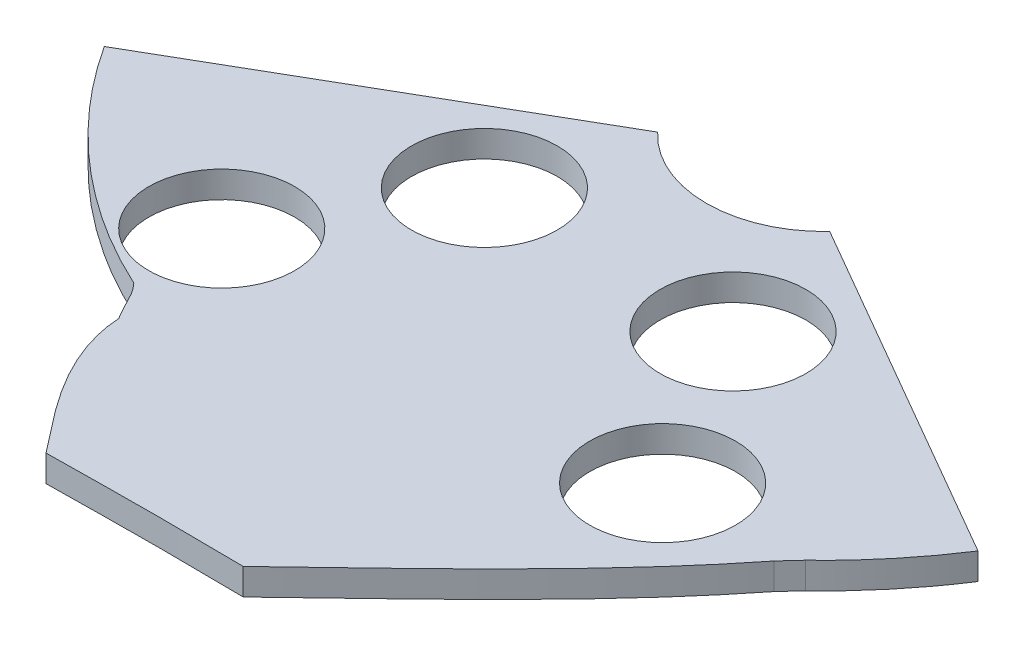
ISO-10303-21;
HEADER;
FILE_DESCRIPTION(('STEP AP214'),'2;1');
FILE_NAME('part.step','',(''),(''),'','','');
FILE_SCHEMA(('AUTOMOTIVE_DESIGN { 1 0 10303 214 1 1 1 1 }'));
ENDSEC;
DATA;
#1=APPLICATION_CONTEXT('core data for automotive mechanical design processes');
#2=APPLICATION_PROTOCOL_DEFINITION('international standard','automotive_design',2000,#1);
#3=PRODUCT_CONTEXT('',#1,'mechanical');
#4=PRODUCT('Part','Part','',(#3));
#5=PRODUCT_RELATED_PRODUCT_CATEGORY('part','',(#4));
#6=PRODUCT_DEFINITION_FORMATION('','',#4);
#7=PRODUCT_DEFINITION_CONTEXT('part definition',#1,'design');
#8=PRODUCT_DEFINITION('design','',#6,#7);
#9=PRODUCT_DEFINITION_SHAPE('','',#8);
#10=(LENGTH_UNIT() NAMED_UNIT(*) SI_UNIT(.MILLI.,.METRE.));
#11=(NAMED_UNIT(*) PLANE_ANGLE_UNIT() SI_UNIT($,.RADIAN.));
#12=(NAMED_UNIT(*) SI_UNIT($,.STERADIAN.) SOLID_ANGLE_UNIT());
#13=UNCERTAINTY_MEASURE_WITH_UNIT(LENGTH_MEASURE(1.E-05),#10,'distance_accuracy_value','');
#14=(GEOMETRIC_REPRESENTATION_CONTEXT(3) GLOBAL_UNCERTAINTY_ASSIGNED_CONTEXT((#13)) GLOBAL_UNIT_ASSIGNED_CONTEXT((#10,
#11,#12)) REPRESENTATION_CONTEXT('',''));
#15=CARTESIAN_POINT('',(0.,0.,0.));
#16=DIRECTION('',(0.,0.,1.));
#17=DIRECTION('',(1.,0.,0.));
#18=AXIS2_PLACEMENT_3D('',#15,#16,#17);
#19=CARTESIAN_POINT('',(-51.3744656245149,-79.736,59.3542968088145));
#20=DIRECTION('',(0.,-1.,0.));
#21=DIRECTION('',(0.,0.,-1.));
#22=AXIS2_PLACEMENT_3D('',#19,#20,#21);
#23=PLANE('',#22);
#24=CARTESIAN_POINT('',(18.75,-79.736,32.476));
#25=DIRECTION('',(0.,-1.,0.));
#26=DIRECTION('',(0.,0.,-1.));
#27=AXIS2_PLACEMENT_3D('',#24,#25,#26);
#28=CIRCLE('',#27,10.999845998306);
#29=CARTESIAN_POINT('',(18.75,-79.736,21.476154001694));
#30=VERTEX_POINT('',#29);
#31=EDGE_CURVE('E441',#30,#30,#28,.T.);
#32=ORIENTED_EDGE('',*,*,#31,.F.);
#33=EDGE_LOOP('',(#32));
#34=FACE_BOUND('',#33,.T.);
#35=CARTESIAN_POINT('',(-33.25,-79.736,57.591));
#36=DIRECTION('',(0.,-1.,0.));
#37=DIRECTION('',(0.,0.,-1.));
#38=AXIS2_PLACEMENT_3D('',#35,#36,#37);
#39=CIRCLE('',#38,10.999845998306);
#40=CARTESIAN_POINT('',(-33.25,-79.736,46.591154001694));
#41=VERTEX_POINT('',#40);
#42=EDGE_CURVE('E422',#41,#41,#39,.T.);
#43=ORIENTED_EDGE('',*,*,#42,.F.);
#44=EDGE_LOOP('',(#43));
#45=FACE_BOUND('',#44,.T.);
#46=CARTESIAN_POINT('',(-65.8942438215736,-79.736,42.6629141284688));
#47=CARTESIAN_POINT('',(-63.8827481904038,-79.736,45.7686245440156));
#48=CARTESIAN_POINT('',(-61.6539292810758,-79.736,48.7320308633863));
#49=CARTESIAN_POINT('',(-56.7974919336609,-79.736,54.3132559350805));
#50=CARTESIAN_POINT('',(-54.1711000900539,-79.736,56.9332339110172));
#51=CARTESIAN_POINT('',(-48.5777787978724,-79.736,61.7754050359472));
#52=CARTESIAN_POINT('',(-45.6092243661694,-79.736,63.9978165793015));
#53=CARTESIAN_POINT('',(-39.388275965928,-79.736,68.0038052688254));
#54=CARTESIAN_POINT('',(-36.137447517544,-79.736,69.7858194193251));
#55=CARTESIAN_POINT('',(-32.7753968486862,-79.736,71.330219755523));
#56=B_SPLINE_CURVE_WITH_KNOTS('',3,(#46,#47,#48,#49,#50,#51,#52,#53,#54,#55),.UNSPECIFIED.,.F.,
.F.,(4,2,2,2,4),(0.,0.25,0.5,0.75,0.999998439772798),.UNSPECIFIED.);
#57=CARTESIAN_POINT('',(-32.7753968486862,-79.736,71.330219755523));
#58=VERTEX_POINT('',#57);
#59=CARTESIAN_POINT('',(-65.8942438215736,-79.736,42.6629141284688));
#60=VERTEX_POINT('',#59);
#61=EDGE_CURVE('E378',#58,#60,#56,.F.);
#62=ORIENTED_EDGE('',*,*,#61,.T.);
#63=DIRECTION('',(0.866025113443951,0.,-0.500000502884138));
#64=VECTOR('',#63,1.);
#65=CARTESIAN_POINT('',(-65.8942438215736,-79.736,42.6629141284688));
#66=LINE('',#65,#64);
#67=CARTESIAN_POINT('',(-12.9766531358799,-79.736,12.1108879302399));
#68=VERTEX_POINT('',#67);
#69=EDGE_CURVE('E103',#60,#68,#66,.T.);
#70=ORIENTED_EDGE('',*,*,#69,.T.);
#71=CARTESIAN_POINT('',(0.,-79.736,0.));
#72=DIRECTION('',(0.,1.,0.));
#73=DIRECTION('',(0.,0.,-1.));
#74=AXIS2_PLACEMENT_3D('',#71,#72,#73);
#75=CIRCLE('',#74,17.7501305084715);
#76=CARTESIAN_POINT('',(12.9766531358511,-79.736,12.1108879302707));
#77=VERTEX_POINT('',#76);
#78=EDGE_CURVE('E272',#68,#77,#75,.T.);
#79=ORIENTED_EDGE('',*,*,#78,.T.);
#80=DIRECTION('',(0.866025113442766,0.,0.500000502886192));
#81=VECTOR('',#80,1.);
#82=CARTESIAN_POINT('',(12.9766531358511,-79.736,12.1108879302707));
#83=LINE('',#82,#81);
#84=CARTESIAN_POINT('',(65.8946490574718,-79.736,42.6631480920524));
#85=VERTEX_POINT('',#84);
#86=EDGE_CURVE('E249',#77,#85,#83,.T.);
#87=ORIENTED_EDGE('',*,*,#86,.T.);
#88=CARTESIAN_POINT('',(54.0938296330947,-79.736,56.8874461713515));
#89=CARTESIAN_POINT('',(58.5691281294252,-79.736,52.6328397716428));
#90=CARTESIAN_POINT('',(62.5386434676811,-79.736,47.8470683377158));
#91=CARTESIAN_POINT('',(65.8946490574718,-79.736,42.6631480920524));
#92=B_SPLINE_CURVE_WITH_KNOTS('',3,(#88,#89,#90,#91),.UNSPECIFIED.,.F.,.F.,(4,4),(0.,1.),.UNSPECIFIED.);
#93=CARTESIAN_POINT('',(54.0938296330947,-79.736,56.8874461713515));
#94=VERTEX_POINT('',#93);
#95=EDGE_CURVE('E244',#85,#94,#92,.F.);
#96=ORIENTED_EDGE('',*,*,#95,.T.);
#97=CARTESIAN_POINT('',(51.8308640813029,-79.736,59.3503086795207));
#98=CARTESIAN_POINT('',(52.2090824304852,-79.736,58.9367883102798));
#99=CARTESIAN_POINT('',(52.774487618931,-79.736,58.3186107186601));
#100=CARTESIAN_POINT('',(53.5289928428999,-79.736,57.4978200718601));
#101=CARTESIAN_POINT('',(53.9055992262694,-79.736,57.0908516822211));
#102=CARTESIAN_POINT('',(54.0938293825005,-79.736,56.8874464109734));
#103=B_SPLINE_CURVE_WITH_KNOTS('',3,(#97,#98,#99,#100,#101,#102),.UNSPECIFIED.,.F.,.F.,(4,1,1,
4),(0.,0.502506100749952,0.751204316106615,0.999709685611501),.UNSPECIFIED.);
#104=CARTESIAN_POINT('',(51.8308640813029,-79.736,59.3503086795207));
#105=VERTEX_POINT('',#104);
#106=EDGE_CURVE('E321',#94,#105,#103,.F.);
#107=ORIENTED_EDGE('',*,*,#106,.T.);
#108=CARTESIAN_POINT('',(12.50114263892,-79.736,100.101817820424));
#109=CARTESIAN_POINT('',(13.4567435357035,-79.736,99.1907386478085));
#110=CARTESIAN_POINT('',(17.1826086801516,-79.736,95.6384626458625));
#111=CARTESIAN_POINT('',(23.6708806146773,-79.736,89.4372736258751));
#112=CARTESIAN_POINT('',(30.521917845292,-79.736,82.7565825518136));
#113=CARTESIAN_POINT('',(35.9083360868747,-79.736,77.3163045776234));
#114=CARTESIAN_POINT('',(39.2812333530397,-79.736,73.7989143731012));
#115=CARTESIAN_POINT('',(41.8873978191866,-79.736,70.9932657476418));
#116=CARTESIAN_POINT('',(43.8356899522479,-79.736,68.8462238655221));
#117=CARTESIAN_POINT('',(45.6785344824626,-79.736,66.7645026985834));
#118=CARTESIAN_POINT('',(47.2316265341137,-79.736,64.9612800655262));
#119=CARTESIAN_POINT('',(48.4285891893798,-79.736,63.5414958994636));
#120=CARTESIAN_POINT('',(49.3134890804372,-79.736,62.476336138693));
#121=CARTESIAN_POINT('',(50.1746951263699,-79.736,61.4236698699558));
#122=CARTESIAN_POINT('',(51.012969965288,-79.736,60.3844536504251));
#123=CARTESIAN_POINT('',(51.5599477325893,-79.736,59.6928541746198));
#124=CARTESIAN_POINT('',(51.8308640813029,-79.736,59.3503086795208));
#125=B_SPLINE_CURVE_WITH_KNOTS('',3,(#108,#109,#110,#111,#112,#113,#114,#115,#116,#117,#118,
#119,#120,#121,#122,#123,#124),.UNSPECIFIED.,.F.,.F.,(4,1,1,1,1,1,1,1,1,1,1,1,1,1,4),
(-1.05124100868714E-05,0.0698677895870934,0.272443323329122,0.475001581915418,0.576289880920163,
0.677613414643248,0.732903791357748,0.778953910011915,0.831054131092889,0.880043672074943,
0.904904417935356,0.92933670277285,0.953332912070451,0.976886002906732,0.999999999999999),.UNSPECIFIED.);
#126=CARTESIAN_POINT('',(12.5011426389199,-79.736,100.101817820424));
#127=VERTEX_POINT('',#126);
#128=EDGE_CURVE('E129',#105,#127,#125,.F.);
#129=ORIENTED_EDGE('',*,*,#128,.T.);
#130=CARTESIAN_POINT('',(12.5011426389196,-79.736,100.101817820425));
#131=CARTESIAN_POINT('',(8.42695814698674,-79.736,100.046886388667));
#132=CARTESIAN_POINT('',(-1.29797001511729,-79.736,99.9341567337903));
#133=CARTESIAN_POINT('',(-11.4435352487319,-79.736,100.092202116382));
#134=CARTESIAN_POINT('',(-17.1838062368695,-79.736,100.168393838282));
#135=B_SPLINE_CURVE_WITH_KNOTS('',3,(#130,#131,#132,#133,#134),.UNSPECIFIED.,.F.,.F.,(4,1,4),
(2.84115599231244E-07,0.429281197083109,1.00000143842256),.UNSPECIFIED.);
#136=CARTESIAN_POINT('',(-17.1838062368695,-79.736,100.168393838282));
#137=VERTEX_POINT('',#136);
#138=EDGE_CURVE('E122',#127,#137,#135,.T.);
#139=ORIENTED_EDGE('',*,*,#138,.T.);
#140=CARTESIAN_POINT('',(-29.2657144042873,-79.736,77.1347365866139));
#141=CARTESIAN_POINT('',(-29.2563853371054,-79.736,77.29160222362));
#142=CARTESIAN_POINT('',(-29.237630985823,-79.736,77.6069617530737));
#143=CARTESIAN_POINT('',(-29.1704613666872,-79.736,78.3250285768316));
#144=CARTESIAN_POINT('',(-29.0359639998365,-79.736,79.2994675042715));
#145=CARTESIAN_POINT('',(-28.7931696299422,-79.736,80.5067478320437));
#146=CARTESIAN_POINT('',(-28.4798034270866,-79.736,81.7166337905029));
#147=CARTESIAN_POINT('',(-27.985400310185,-79.736,83.2932829434394));
#148=CARTESIAN_POINT('',(-27.2348281919928,-79.736,85.2119362071262));
#149=CARTESIAN_POINT('',(-26.1734113928556,-79.736,87.413440844013));
#150=CARTESIAN_POINT('',(-25.1790380852882,-79.736,89.1782488120442));
#151=CARTESIAN_POINT('',(-24.3298266601933,-79.736,90.5532900357629));
#152=CARTESIAN_POINT('',(-23.4472902343676,-79.736,91.907670614331));
#153=CARTESIAN_POINT('',(-22.2870052804421,-79.736,93.5658226604169));
#154=CARTESIAN_POINT('',(-20.8271576694844,-79.736,95.5106160448412));
#155=CARTESIAN_POINT('',(-19.5693895270185,-79.736,97.1178197302672));
#156=CARTESIAN_POINT('',(-18.5639541020905,-79.736,98.3939691046897));
#157=CARTESIAN_POINT('',(-17.9544810412098,-79.736,99.1713403557162));
#158=CARTESIAN_POINT('',(-17.4997800467793,-79.736,99.7570083844145));
#159=CARTESIAN_POINT('',(-17.2884015855746,-79.736,100.032214814309));
#160=CARTESIAN_POINT('',(-17.1838062367888,-79.736,100.16839383822));
#161=B_SPLINE_CURVE_WITH_KNOTS('',3,(#140,#141,#142,#143,#144,#145,#146,#147,#148,#149,#150,
#151,#152,#153,#154,#155,#156,#157,#158,#159,#160),.UNSPECIFIED.,.F.,.F.,(4,1,1,1,1,1,1,1,1,1,1,
1,1,1,1,1,1,1,4),(-5.2859938648453E-12,0.0178333380724044,0.0358517798990282,0.0818386581539615,
0.129396851846109,0.175531507659159,0.22361898239405,0.316857336126395,0.409046740090165,
0.500787644727331,0.546614283965671,0.592451839064236,0.684236565631414,0.776233629151525,
0.868406014226935,0.915852561425258,0.960618575724023,0.980514130934734,1.00000206764503),.UNSPECIFIED.);
#162=CARTESIAN_POINT('',(-29.2657144042876,-79.736,77.13473658661));
#163=VERTEX_POINT('',#162);
#164=EDGE_CURVE('E126',#137,#163,#161,.F.);
#165=ORIENTED_EDGE('',*,*,#164,.T.);
#166=CARTESIAN_POINT('',(-32.7753968486862,-79.736,71.330219755523));
#167=CARTESIAN_POINT('',(-32.711763401291,-79.736,71.3985403598082));
#168=CARTESIAN_POINT('',(-32.5862079000733,-79.736,71.5333441157831));
#169=CARTESIAN_POINT('',(-32.4079194945558,-79.736,71.7396422406054));
#170=CARTESIAN_POINT('',(-32.204895997816,-79.736,71.9879655203411));
#171=CARTESIAN_POINT('',(-31.9790670678011,-79.736,72.2867076529746));
#172=CARTESIAN_POINT('',(-31.6539778778473,-79.736,72.7576020328422));
#173=CARTESIAN_POINT('',(-31.2820379021762,-79.736,73.372449100164));
#174=CARTESIAN_POINT('',(-30.8790915265443,-79.736,74.1340327634538));
#175=CARTESIAN_POINT('',(-30.4970327768303,-79.736,74.9081136041313));
#176=CARTESIAN_POINT('',(-30.1123973966761,-79.736,75.6813386820739));
#177=CARTESIAN_POINT('',(-29.784623259114,-79.736,76.2896546483873));
#178=CARTESIAN_POINT('',(-29.5413525677444,-79.736,76.7009366921713));
#179=CARTESIAN_POINT('',(-29.3973937280341,-79.7359999999999,76.9329551463175));
#180=CARTESIAN_POINT('',(-29.3110549988988,-79.736,77.0652584276437));
#181=CARTESIAN_POINT('',(-29.2657144042932,-79.736,77.1347365866137));
#182=B_SPLINE_CURVE_WITH_KNOTS('',3,(#166,#167,#168,#169,#170,#171,#172,#173,#174,#175,#176,
#177,#178,#179,#180,#181),.UNSPECIFIED.,.F.,.F.,(4,1,1,1,1,1,1,1,1,1,1,1,1,4),
(1.24385543651684E-05,0.0411633332677447,0.0812074927717041,0.120172671454011,0.182533525210417,
0.246217323006076,0.372328209449143,0.498987640403262,0.625906300256195,0.752824917169397,
0.87965179275495,0.930365352175966,0.963431747251974,1.),.UNSPECIFIED.);
#183=EDGE_CURVE('E51',#163,#58,#182,.F.);
#184=ORIENTED_EDGE('',*,*,#183,.T.);
#185=EDGE_LOOP('',(#62,#70,#79,#87,#96,#107,#129,#139,#165,#184));
#186=FACE_BOUND('',#185,.T.);
#187=CARTESIAN_POINT('',(33.25,-79.736,57.591));
#188=DIRECTION('',(0.,-1.,0.));
#189=DIRECTION('',(0.,0.,-1.));
#190=AXIS2_PLACEMENT_3D('',#187,#188,#189);
#191=CIRCLE('',#190,10.999845998306);
#192=CARTESIAN_POINT('',(33.25,-79.736,46.591154001694));
#193=VERTEX_POINT('',#192);
#194=EDGE_CURVE('E429',#193,#193,#191,.T.);
#195=ORIENTED_EDGE('',*,*,#194,.F.);
#196=EDGE_LOOP('',(#195));
#197=FACE_BOUND('',#196,.T.);
#198=CARTESIAN_POINT('',(-18.75,-79.736,32.476));
#199=DIRECTION('',(0.,-1.,0.));
#200=DIRECTION('',(0.,0.,-1.));
#201=AXIS2_PLACEMENT_3D('',#198,#199,#200);
#202=CIRCLE('',#201,10.999845998306);
#203=CARTESIAN_POINT('',(-18.75,-79.736,21.476154001694));
#204=VERTEX_POINT('',#203);
#205=EDGE_CURVE('E447',#204,#204,#202,.T.);
#206=ORIENTED_EDGE('',*,*,#205,.F.);
#207=EDGE_LOOP('',(#206));
#208=FACE_BOUND('',#207,.T.);
#209=ADVANCED_FACE('F30',(#34,#45,#186,#197,#208),#23,.T.);
#210=CARTESIAN_POINT('',(-51.3744656245149,-75.736,59.3542968088145));
#211=DIRECTION('',(0.,-1.,0.));
#212=DIRECTION('',(0.,0.,-1.));
#213=AXIS2_PLACEMENT_3D('',#210,#211,#212);
#214=PLANE('',#213);
#215=CARTESIAN_POINT('',(18.75,-75.736,32.476));
#216=DIRECTION('',(0.,-1.,0.));
#217=DIRECTION('',(0.,0.,-1.));
#218=AXIS2_PLACEMENT_3D('',#215,#216,#217);
#219=CIRCLE('',#218,10.999845998306);
#220=CARTESIAN_POINT('',(18.75,-75.736,21.476154001694));
#221=VERTEX_POINT('',#220);
#222=EDGE_CURVE('E444',#221,#221,#219,.T.);
#223=ORIENTED_EDGE('',*,*,#222,.T.);
#224=EDGE_LOOP('',(#223));
#225=FACE_BOUND('',#224,.T.);
#226=CARTESIAN_POINT('',(-33.25,-75.736,57.591));
#227=DIRECTION('',(0.,-1.,0.));
#228=DIRECTION('',(0.,0.,-1.));
#229=AXIS2_PLACEMENT_3D('',#226,#227,#228);
#230=CIRCLE('',#229,10.999845998306);
#231=CARTESIAN_POINT('',(-33.25,-75.736,46.591154001694));
#232=VERTEX_POINT('',#231);
#233=EDGE_CURVE('E424',#232,#232,#230,.T.);
#234=ORIENTED_EDGE('',*,*,#233,.T.);
#235=EDGE_LOOP('',(#234));
#236=FACE_BOUND('',#235,.T.);
#237=CARTESIAN_POINT('',(-32.7753968486862,-75.736,71.330219755523));
#238=CARTESIAN_POINT('',(-36.137447517544,-75.736,69.7858194193251));
#239=CARTESIAN_POINT('',(-39.388275965928,-75.736,68.0038052688254));
#240=CARTESIAN_POINT('',(-45.6092243661694,-75.736,63.9978165793015));
#241=CARTESIAN_POINT('',(-48.5777787978724,-75.736,61.7754050359472));
#242=CARTESIAN_POINT('',(-54.1711000900539,-75.736,56.9332339110172));
#243=CARTESIAN_POINT('',(-56.7974919336609,-75.736,54.3132559350805));
#244=CARTESIAN_POINT('',(-61.6539292810758,-75.736,48.7320308633863));
#245=CARTESIAN_POINT('',(-63.8827481904038,-75.736,45.7686245440156));
#246=CARTESIAN_POINT('',(-65.8942438215736,-75.736,42.6629141284688));
#247=B_SPLINE_CURVE_WITH_KNOTS('',3,(#237,#238,#239,#240,#241,#242,#243,#244,#245,#246),
.UNSPECIFIED.,.F.,.F.,(4,2,2,2,4),(0.,0.249998439772758,0.499998439772758,0.749998439772758,
0.999998439772798),.UNSPECIFIED.);
#248=CARTESIAN_POINT('',(-32.7753968486862,-75.736,71.330219755523));
#249=VERTEX_POINT('',#248);
#250=CARTESIAN_POINT('',(-65.8942438215736,-75.736,42.6629141284688));
#251=VERTEX_POINT('',#250);
#252=EDGE_CURVE('E405',#249,#251,#247,.T.);
#253=ORIENTED_EDGE('',*,*,#252,.F.);
#254=CARTESIAN_POINT('',(-29.2657144042932,-75.736,77.1347365866137));
#255=CARTESIAN_POINT('',(-29.3110549988988,-75.736,77.0652584276437));
#256=CARTESIAN_POINT('',(-29.3973937280341,-75.7359999999999,76.9329551463175));
#257=CARTESIAN_POINT('',(-29.5413525677444,-75.736,76.7009366921713));
#258=CARTESIAN_POINT('',(-29.784623259114,-75.736,76.2896546483873));
#259=CARTESIAN_POINT('',(-30.1123973966761,-75.736,75.6813386820739));
#260=CARTESIAN_POINT('',(-30.4970327768303,-75.736,74.9081136041313));
#261=CARTESIAN_POINT('',(-30.8790915265443,-75.736,74.1340327634538));
#262=CARTESIAN_POINT('',(-31.2820379021762,-75.736,73.372449100164));
#263=CARTESIAN_POINT('',(-31.6539778778473,-75.736,72.7576020328422));
#264=CARTESIAN_POINT('',(-31.9790670678011,-75.736,72.2867076529746));
#265=CARTESIAN_POINT('',(-32.204895997816,-75.736,71.9879655203411));
#266=CARTESIAN_POINT('',(-32.4079194945558,-75.736,71.7396422406054));
#267=CARTESIAN_POINT('',(-32.5862079000733,-75.736,71.5333441157831));
#268=CARTESIAN_POINT('',(-32.711763401291,-75.736,71.3985403598082));
#269=CARTESIAN_POINT('',(-32.7753968486862,-75.736,71.330219755523));
#270=B_SPLINE_CURVE_WITH_KNOTS('',3,(#254,#255,#256,#257,#258,#259,#260,#261,#262,#263,#264,
#265,#266,#267,#268,#269),.UNSPECIFIED.,.F.,.F.,(4,1,1,1,1,1,1,1,1,1,1,1,1,4),
(1.24385543651474E-05,0.0365806913023914,0.0696470863783993,0.120360645799416,0.247187521384968,
0.37410613829817,0.501024798151103,0.627684229105222,0.753795115548289,0.817478913343948,
0.879839767100354,0.918804945782661,0.95884910528662,1.),.UNSPECIFIED.);
#271=CARTESIAN_POINT('',(-29.2657144042876,-75.736,77.13473658661));
#272=VERTEX_POINT('',#271);
#273=EDGE_CURVE('E94',#272,#249,#270,.T.);
#274=ORIENTED_EDGE('',*,*,#273,.F.);
#275=CARTESIAN_POINT('',(-17.1838062367888,-75.736,100.16839383822));
#276=CARTESIAN_POINT('',(-17.2884015855746,-75.736,100.032214814309));
#277=CARTESIAN_POINT('',(-17.4997800467793,-75.736,99.7570083844145));
#278=CARTESIAN_POINT('',(-17.9544810412098,-75.736,99.1713403557162));
#279=CARTESIAN_POINT('',(-18.5639541020905,-75.736,98.3939691046897));
#280=CARTESIAN_POINT('',(-19.5693895270185,-75.736,97.1178197302672));
#281=CARTESIAN_POINT('',(-20.8271576694844,-75.736,95.5106160448412));
#282=CARTESIAN_POINT('',(-22.2870052804421,-75.736,93.5658226604169));
#283=CARTESIAN_POINT('',(-23.4472902343676,-75.736,91.907670614331));
#284=CARTESIAN_POINT('',(-24.3298266601933,-75.736,90.5532900357629));
#285=CARTESIAN_POINT('',(-25.1790380852882,-75.736,89.1782488120442));
#286=CARTESIAN_POINT('',(-26.1734113928556,-75.736,87.413440844013));
#287=CARTESIAN_POINT('',(-27.2348281919928,-75.736,85.2119362071262));
#288=CARTESIAN_POINT('',(-27.985400310185,-75.736,83.2932829434394));
#289=CARTESIAN_POINT('',(-28.4798034270866,-75.736,81.7166337905029));
#290=CARTESIAN_POINT('',(-28.7931696299422,-75.736,80.5067478320437));
#291=CARTESIAN_POINT('',(-29.0359639998365,-75.736,79.2994675042715));
#292=CARTESIAN_POINT('',(-29.1704613666872,-75.736,78.3250285768316));
#293=CARTESIAN_POINT('',(-29.237630985823,-75.736,77.6069617530737));
#294=CARTESIAN_POINT('',(-29.2563853371054,-75.736,77.29160222362));
#295=CARTESIAN_POINT('',(-29.2657144042873,-75.736,77.1347365866139));
#296=B_SPLINE_CURVE_WITH_KNOTS('',3,(#275,#276,#277,#278,#279,#280,#281,#282,#283,#284,#285,
#286,#287,#288,#289,#290,#291,#292,#293,#294,#295),.UNSPECIFIED.,.F.,.F.,(4,1,1,1,1,1,1,1,1,1,1,
1,1,1,1,1,1,1,4),(-5.28589752635466E-12,0.0194879367050133,0.0393834919157252,
0.0841495062144901,0.131596053412813,0.223768438488223,0.315765502008334,0.407550228575511,
0.453387783674077,0.499214422912417,0.590955327549583,0.683144731513353,0.776383085245698,
0.824470559980589,0.870605215793639,0.918163409485786,0.96415028774072,0.982168729567343,
1.00000206764503),.UNSPECIFIED.);
#297=CARTESIAN_POINT('',(-17.1838062368695,-75.736,100.168393838282));
#298=VERTEX_POINT('',#297);
#299=EDGE_CURVE('E87',#298,#272,#296,.T.);
#300=ORIENTED_EDGE('',*,*,#299,.F.);
#301=CARTESIAN_POINT('',(12.5011426389196,-75.736,100.101817820425));
#302=CARTESIAN_POINT('',(8.42695814698674,-75.736,100.046886388667));
#303=CARTESIAN_POINT('',(-1.29797001511729,-75.736,99.9341567337903));
#304=CARTESIAN_POINT('',(-11.4435352487319,-75.736,100.092202116382));
#305=CARTESIAN_POINT('',(-17.1838062368695,-75.736,100.168393838282));
#306=B_SPLINE_CURVE_WITH_KNOTS('',3,(#301,#302,#303,#304,#305),.UNSPECIFIED.,.F.,.F.,(4,1,4),
(2.84115599231244E-07,0.429281197083109,1.00000143842256),.UNSPECIFIED.);
#307=CARTESIAN_POINT('',(12.5011426389199,-75.736,100.101817820424));
#308=VERTEX_POINT('',#307);
#309=EDGE_CURVE('E138',#308,#298,#306,.T.);
#310=ORIENTED_EDGE('',*,*,#309,.F.);
#311=CARTESIAN_POINT('',(51.8308640813029,-75.736,59.3503086795208));
#312=CARTESIAN_POINT('',(51.5599477325893,-75.736,59.6928541746198));
#313=CARTESIAN_POINT('',(51.012969965288,-75.736,60.3844536504251));
#314=CARTESIAN_POINT('',(50.1746951263699,-75.736,61.4236698699558));
#315=CARTESIAN_POINT('',(49.3134890804372,-75.736,62.476336138693));
#316=CARTESIAN_POINT('',(48.4285891893798,-75.736,63.5414958994636));
#317=CARTESIAN_POINT('',(47.2316265341137,-75.736,64.9612800655262));
#318=CARTESIAN_POINT('',(45.6785344824626,-75.736,66.7645026985834));
#319=CARTESIAN_POINT('',(43.8356899522479,-75.736,68.8462238655221));
#320=CARTESIAN_POINT('',(41.8873978191866,-75.736,70.9932657476418));
#321=CARTESIAN_POINT('',(39.2812333530397,-75.736,73.7989143731012));
#322=CARTESIAN_POINT('',(35.9083360868747,-75.736,77.3163045776234));
#323=CARTESIAN_POINT('',(30.521917845292,-75.736,82.7565825518136));
#324=CARTESIAN_POINT('',(23.6708806146773,-75.736,89.4372736258751));
#325=CARTESIAN_POINT('',(17.1826086801516,-75.736,95.6384626458625));
#326=CARTESIAN_POINT('',(13.4567435357035,-75.736,99.1907386478085));
#327=CARTESIAN_POINT('',(12.50114263892,-75.736,100.101817820424));
#328=B_SPLINE_CURVE_WITH_KNOTS('',3,(#311,#312,#313,#314,#315,#316,#317,#318,#319,#320,#321,
#322,#323,#324,#325,#326,#327),.UNSPECIFIED.,.F.,.F.,(4,1,1,1,1,1,1,1,1,1,1,1,1,1,4),
(-1.05124100868559E-05,0.0231034846831808,0.0466565755194611,0.0706527848170619,
0.0950850696545558,0.11994581551497,0.168935356497023,0.221035577577997,0.267085696232165,
0.322376072946665,0.42369960666975,0.524987905674494,0.72754616426079,0.930121698002819,
0.999999999999999),.UNSPECIFIED.);
#329=CARTESIAN_POINT('',(51.8308640813029,-75.736,59.3503086795207));
#330=VERTEX_POINT('',#329);
#331=EDGE_CURVE('E312',#330,#308,#328,.T.);
#332=ORIENTED_EDGE('',*,*,#331,.F.);
#333=CARTESIAN_POINT('',(54.0938293825005,-75.7359999999999,56.8874464109734));
#334=CARTESIAN_POINT('',(53.9055992262694,-75.7359999999999,57.0908516822211));
#335=CARTESIAN_POINT('',(53.5289928428999,-75.7359999999999,57.4978200718601));
#336=CARTESIAN_POINT('',(52.774487618931,-75.7359999999999,58.3186107186601));
#337=CARTESIAN_POINT('',(52.2090824304852,-75.7359999999999,58.9367883102798));
#338=CARTESIAN_POINT('',(51.8308640813029,-75.7359999999999,59.3503086795207));
#339=B_SPLINE_CURVE_WITH_KNOTS('',3,(#333,#334,#335,#336,#337,#338),.UNSPECIFIED.,.F.,.F.,(4,1,
1,4),(0.,0.248505369504887,0.497203584861549,0.999709685611501),.UNSPECIFIED.);
#340=CARTESIAN_POINT('',(54.0938296330947,-75.736,56.8874461713515));
#341=VERTEX_POINT('',#340);
#342=EDGE_CURVE('E327',#341,#330,#339,.T.);
#343=ORIENTED_EDGE('',*,*,#342,.F.);
#344=CARTESIAN_POINT('',(65.8946490574718,-75.736,42.6631480920524));
#345=CARTESIAN_POINT('',(62.5386434676811,-75.736,47.8470683377158));
#346=CARTESIAN_POINT('',(58.5691281294252,-75.736,52.6328397716428));
#347=CARTESIAN_POINT('',(54.0938296330947,-75.736,56.8874461713515));
#348=B_SPLINE_CURVE_WITH_KNOTS('',3,(#344,#345,#346,#347),.UNSPECIFIED.,.F.,.F.,(4,4),(0.,1.),.UNSPECIFIED.);
#349=CARTESIAN_POINT('',(65.8946490574718,-75.736,42.6631480920524));
#350=VERTEX_POINT('',#349);
#351=EDGE_CURVE('E363',#350,#341,#348,.T.);
#352=ORIENTED_EDGE('',*,*,#351,.F.);
#353=DIRECTION('',(0.866025113442766,0.,0.500000502886192));
#354=VECTOR('',#353,1.);
#355=CARTESIAN_POINT('',(12.9766531358511,-75.736,12.1108879302707));
#356=LINE('',#355,#354);
#357=CARTESIAN_POINT('',(12.9766531358511,-75.736,12.1108879302707));
#358=VERTEX_POINT('',#357);
#359=EDGE_CURVE('E188',#358,#350,#356,.T.);
#360=ORIENTED_EDGE('',*,*,#359,.F.);
#361=CARTESIAN_POINT('',(0.,-75.736,0.));
#362=DIRECTION('',(0.,1.,0.));
#363=DIRECTION('',(0.,0.,-1.));
#364=AXIS2_PLACEMENT_3D('',#361,#362,#363);
#365=CIRCLE('',#364,17.7501305084715);
#366=CARTESIAN_POINT('',(-12.9766531358799,-75.736,12.1108879302399));
#367=VERTEX_POINT('',#366);
#368=EDGE_CURVE('E183',#367,#358,#365,.T.);
#369=ORIENTED_EDGE('',*,*,#368,.F.);
#370=DIRECTION('',(0.866025113443951,0.,-0.500000502884138));
#371=VECTOR('',#370,1.);
#372=CARTESIAN_POINT('',(-65.8942438215736,-75.736,42.6629141284688));
#373=LINE('',#372,#371);
#374=EDGE_CURVE('E189',#251,#367,#373,.T.);
#375=ORIENTED_EDGE('',*,*,#374,.F.);
#376=EDGE_LOOP('',(#253,#274,#300,#310,#332,#343,#352,#360,#369,#375));
#377=FACE_BOUND('',#376,.T.);
#378=CARTESIAN_POINT('',(33.25,-75.736,57.591));
#379=DIRECTION('',(0.,-1.,0.));
#380=DIRECTION('',(0.,0.,-1.));
#381=AXIS2_PLACEMENT_3D('',#378,#379,#380);
#382=CIRCLE('',#381,10.999845998306);
#383=CARTESIAN_POINT('',(33.25,-75.736,46.591154001694));
#384=VERTEX_POINT('',#383);
#385=EDGE_CURVE('E432',#384,#384,#382,.T.);
#386=ORIENTED_EDGE('',*,*,#385,.T.);
#387=EDGE_LOOP('',(#386));
#388=FACE_BOUND('',#387,.T.);
#389=CARTESIAN_POINT('',(-18.75,-75.736,32.476));
#390=DIRECTION('',(0.,-1.,0.));
#391=DIRECTION('',(0.,0.,-1.));
#392=AXIS2_PLACEMENT_3D('',#389,#390,#391);
#393=CIRCLE('',#392,10.999845998306);
#394=CARTESIAN_POINT('',(-18.75,-75.736,21.476154001694));
#395=VERTEX_POINT('',#394);
#396=EDGE_CURVE('E450',#395,#395,#393,.T.);
#397=ORIENTED_EDGE('',*,*,#396,.T.);
#398=EDGE_LOOP('',(#397));
#399=FACE_BOUND('',#398,.T.);
#400=ADVANCED_FACE('F208',(#225,#236,#377,#388,#399),#214,.F.);
#401=CARTESIAN_POINT('',(-32.7753968486862,-79.736,71.330219755523));
#402=CARTESIAN_POINT('',(-36.137447517544,-79.736,69.7858194193251));
#403=CARTESIAN_POINT('',(-39.388275965928,-79.736,68.0038052688254));
#404=CARTESIAN_POINT('',(-45.6092243661694,-79.736,63.9978165793015));
#405=CARTESIAN_POINT('',(-48.5777787978724,-79.736,61.7754050359472));
#406=CARTESIAN_POINT('',(-54.1711000900539,-79.736,56.9332339110172));
#407=CARTESIAN_POINT('',(-56.7974919336609,-79.736,54.3132559350805));
#408=CARTESIAN_POINT('',(-61.6539292810758,-79.736,48.7320308633863));
#409=CARTESIAN_POINT('',(-63.8827481904038,-79.736,45.7686245440156));
#410=CARTESIAN_POINT('',(-65.8942438215736,-79.736,42.6629141284688));
#411=B_SPLINE_CURVE_WITH_KNOTS('',3,(#401,#402,#403,#404,#405,#406,#407,#408,#409,#410),
.UNSPECIFIED.,.F.,.F.,(4,2,2,2,4),(0.,0.249998439772758,0.499998439772758,0.749998439772758,
0.999998439772798),.UNSPECIFIED.);
#412=DIRECTION('',(0.,1.,0.));
#413=VECTOR('',#412,1.);
#414=SURFACE_OF_LINEAR_EXTRUSION('',#411,#413);
#415=ORIENTED_EDGE('',*,*,#252,.T.);
#416=DIRECTION('',(0.,1.,0.));
#417=VECTOR('',#416,1.);
#418=CARTESIAN_POINT('',(-65.8942438215736,-79.736,42.6629141284688));
#419=LINE('',#418,#417);
#420=EDGE_CURVE('E11',#60,#251,#419,.T.);
#421=ORIENTED_EDGE('',*,*,#420,.F.);
#422=ORIENTED_EDGE('',*,*,#61,.F.);
#423=DIRECTION('',(0.,1.,0.));
#424=VECTOR('',#423,1.);
#425=CARTESIAN_POINT('',(-32.7753968486862,-79.736,71.330219755523));
#426=LINE('',#425,#424);
#427=EDGE_CURVE('E652',#58,#249,#426,.T.);
#428=ORIENTED_EDGE('',*,*,#427,.T.);
#429=EDGE_LOOP('',(#415,#421,#422,#428));
#430=FACE_BOUND('',#429,.T.);
#431=ADVANCED_FACE('F32',(#430),#414,.F.);
#432=CARTESIAN_POINT('',(-65.8942438215736,-79.736,42.6629141284688));
#433=DIRECTION('',(0.500000502884138,0.,0.866025113443951));
#434=DIRECTION('',(0.866025113443951,0.,-0.500000502884138));
#435=AXIS2_PLACEMENT_3D('',#432,#433,#434);
#436=PLANE('',#435);
#437=ORIENTED_EDGE('',*,*,#374,.T.);
#438=DIRECTION('',(0.,1.,0.));
#439=VECTOR('',#438,1.);
#440=CARTESIAN_POINT('',(-12.9766531358799,-79.736,12.1108879302399));
#441=LINE('',#440,#439);
#442=EDGE_CURVE('E42',#68,#367,#441,.T.);
#443=ORIENTED_EDGE('',*,*,#442,.F.);
#444=ORIENTED_EDGE('',*,*,#69,.F.);
#445=ORIENTED_EDGE('',*,*,#420,.T.);
#446=EDGE_LOOP('',(#437,#443,#444,#445));
#447=FACE_BOUND('',#446,.T.);
#448=ADVANCED_FACE('F469',(#447),#436,.F.);
#449=CARTESIAN_POINT('',(0.,-79.736,0.));
#450=DIRECTION('',(0.,1.,0.));
#451=DIRECTION('',(0.,0.,1.));
#452=AXIS2_PLACEMENT_3D('',#449,#450,#451);
#453=CYLINDRICAL_SURFACE('',#452,17.7501305084715);
#454=ORIENTED_EDGE('',*,*,#368,.T.);
#455=DIRECTION('',(0.,1.,0.));
#456=VECTOR('',#455,1.);
#457=CARTESIAN_POINT('',(12.9766531358511,-79.736,12.1108879302707));
#458=LINE('',#457,#456);
#459=EDGE_CURVE('E190',#77,#358,#458,.T.);
#460=ORIENTED_EDGE('',*,*,#459,.F.);
#461=ORIENTED_EDGE('',*,*,#78,.F.);
#462=ORIENTED_EDGE('',*,*,#442,.T.);
#463=EDGE_LOOP('',(#454,#460,#461,#462));
#464=FACE_BOUND('',#463,.T.);
#465=ADVANCED_FACE('F517',(#464),#453,.F.);
#466=CARTESIAN_POINT('',(12.9766531358511,-79.736,12.1108879302707));
#467=DIRECTION('',(-0.500000502886192,0.,0.866025113442766));
#468=DIRECTION('',(0.866025113442766,0.,0.500000502886192));
#469=AXIS2_PLACEMENT_3D('',#466,#467,#468);
#470=PLANE('',#469);
#471=ORIENTED_EDGE('',*,*,#359,.T.);
#472=DIRECTION('',(0.,1.,0.));
#473=VECTOR('',#472,1.);
#474=CARTESIAN_POINT('',(65.8946490574718,-79.736,42.6631480920524));
#475=LINE('',#474,#473);
#476=EDGE_CURVE('E193',#85,#350,#475,.T.);
#477=ORIENTED_EDGE('',*,*,#476,.F.);
#478=ORIENTED_EDGE('',*,*,#86,.F.);
#479=ORIENTED_EDGE('',*,*,#459,.T.);
#480=EDGE_LOOP('',(#471,#477,#478,#479));
#481=FACE_BOUND('',#480,.T.);
#482=ADVANCED_FACE('F263',(#481),#470,.F.);
#483=CARTESIAN_POINT('',(65.8946490574718,-79.736,42.6631480920524));
#484=CARTESIAN_POINT('',(62.5386434676811,-79.736,47.8470683377158));
#485=CARTESIAN_POINT('',(58.5691281294252,-79.736,52.6328397716428));
#486=CARTESIAN_POINT('',(54.0938296330947,-79.736,56.8874461713515));
#487=B_SPLINE_CURVE_WITH_KNOTS('',3,(#483,#484,#485,#486),.UNSPECIFIED.,.F.,.F.,(4,4),(0.,1.),.UNSPECIFIED.);
#488=DIRECTION('',(0.,1.,0.));
#489=VECTOR('',#488,1.);
#490=SURFACE_OF_LINEAR_EXTRUSION('',#487,#489);
#491=ORIENTED_EDGE('',*,*,#351,.T.);
#492=DIRECTION('',(0.,1.,0.));
#493=VECTOR('',#492,1.);
#494=CARTESIAN_POINT('',(54.0938296330947,-79.736,56.8874461713515));
#495=LINE('',#494,#493);
#496=EDGE_CURVE('E329',#94,#341,#495,.T.);
#497=ORIENTED_EDGE('',*,*,#496,.F.);
#498=ORIENTED_EDGE('',*,*,#95,.F.);
#499=ORIENTED_EDGE('',*,*,#476,.T.);
#500=EDGE_LOOP('',(#491,#497,#498,#499));
#501=FACE_BOUND('',#500,.T.);
#502=ADVANCED_FACE('F251',(#501),#490,.F.);
#503=CARTESIAN_POINT('',(54.0938293825005,-79.736,56.8874464109734));
#504=CARTESIAN_POINT('',(53.9055992262694,-79.736,57.0908516822211));
#505=CARTESIAN_POINT('',(53.5289928428999,-79.736,57.4978200718601));
#506=CARTESIAN_POINT('',(52.7742685115982,-79.736,58.3188490751931));
#507=CARTESIAN_POINT('',(52.2086454117641,-79.736,58.9372661188471));
#508=CARTESIAN_POINT('',(51.8302085535677,-79.736,59.3510253926889));
#509=B_SPLINE_CURVE_WITH_KNOTS('',3,(#503,#504,#505,#506,#507,#508),.UNSPECIFIED.,.F.,.F.,(4,1,
1,4),(0.,0.248505369504887,0.497203584861549,1.),.UNSPECIFIED.);
#510=DIRECTION('',(0.,1.,0.));
#511=VECTOR('',#510,1.);
#512=SURFACE_OF_LINEAR_EXTRUSION('',#509,#511);
#513=ORIENTED_EDGE('',*,*,#342,.T.);
#514=DIRECTION('',(0.,1.,0.));
#515=VECTOR('',#514,1.);
#516=CARTESIAN_POINT('',(51.8308640813029,-79.736,59.3503086795207));
#517=LINE('',#516,#515);
#518=EDGE_CURVE('E326',#105,#330,#517,.T.);
#519=ORIENTED_EDGE('',*,*,#518,.F.);
#520=ORIENTED_EDGE('',*,*,#106,.F.);
#521=ORIENTED_EDGE('',*,*,#496,.T.);
#522=EDGE_LOOP('',(#513,#519,#520,#521));
#523=FACE_BOUND('',#522,.T.);
#524=ADVANCED_FACE('F262',(#523),#512,.F.);
#525=CARTESIAN_POINT('',(1691.79790073821,-79.736,1201.34044991605));
#526=CARTESIAN_POINT('',(89.1675057694424,-79.736,-20.4573058449265));
#527=CARTESIAN_POINT('',(78.0473087817284,-79.736,26.8697612392889));
#528=CARTESIAN_POINT('',(50.1746951263699,-79.736,61.4236698699558));
#529=CARTESIAN_POINT('',(49.3134890804372,-79.736,62.476336138693));
#530=CARTESIAN_POINT('',(48.4285891893798,-79.736,63.5414958994636));
#531=CARTESIAN_POINT('',(47.2316265341137,-79.736,64.9612800655262));
#532=CARTESIAN_POINT('',(45.6785344824626,-79.736,66.7645026985834));
#533=CARTESIAN_POINT('',(43.8356899522479,-79.736,68.8462238655221));
#534=CARTESIAN_POINT('',(41.8873978191866,-79.736,70.9932657476418));
#535=CARTESIAN_POINT('',(39.2812333530397,-79.736,73.7989143731012));
#536=CARTESIAN_POINT('',(35.9083360868747,-79.736,77.3163045776234));
#537=CARTESIAN_POINT('',(30.521917845292,-79.736,82.7565825518136));
#538=CARTESIAN_POINT('',(23.6708806146773,-79.736,89.4372736258751));
#539=CARTESIAN_POINT('',(-139.982542749397,-79.736,245.849616124715));
#540=CARTESIAN_POINT('',(-309.039110219615,-79.736,391.104416780439));
#541=CARTESIAN_POINT('',(824.200442558186,-79.736,1887.84382272874));
#542=B_SPLINE_CURVE_WITH_KNOTS('',3,(#525,#526,#527,#528,#529,#530,#531,#532,#533,#534,#535,
#536,#537,#538,#539,#540,#541),.UNSPECIFIED.,.F.,.F.,(4,1,1,1,1,1,1,1,1,1,1,1,1,1,4),
(-2.2788997626125,0.0231034846831808,0.0466565755194611,0.0706527848170619,0.0950850696545558,
0.11994581551497,0.168935356497023,0.221035577577997,0.267085696232165,0.322376072946665,
0.42369960666975,0.524987905674494,0.72754616426079,0.930121698002819,12.5061989523397),.UNSPECIFIED.);
#543=DIRECTION('',(0.,1.,0.));
#544=VECTOR('',#543,1.);
#545=SURFACE_OF_LINEAR_EXTRUSION('',#542,#544);
#546=ORIENTED_EDGE('',*,*,#331,.T.);
#547=DIRECTION('',(0.,1.,0.));
#548=VECTOR('',#547,1.);
#549=CARTESIAN_POINT('',(12.5011426389199,-79.736,100.101817820424));
#550=LINE('',#549,#548);
#551=EDGE_CURVE('E139',#127,#308,#550,.T.);
#552=ORIENTED_EDGE('',*,*,#551,.F.);
#553=ORIENTED_EDGE('',*,*,#128,.F.);
#554=ORIENTED_EDGE('',*,*,#518,.T.);
#555=EDGE_LOOP('',(#546,#552,#553,#554));
#556=FACE_BOUND('',#555,.T.);
#557=ADVANCED_FACE('F288',(#556),#545,.F.);
#558=DIRECTION('',(0.,1.,0.));
#559=VECTOR('',#558,1.);
#560=SURFACE_OF_LINEAR_EXTRUSION('',#135,#559);
#561=ORIENTED_EDGE('',*,*,#309,.T.);
#562=DIRECTION('',(0.,1.,0.));
#563=VECTOR('',#562,1.);
#564=CARTESIAN_POINT('',(-17.1838062368695,-79.736,100.168393838282));
#565=LINE('',#564,#563);
#566=EDGE_CURVE('E135',#137,#298,#565,.T.);
#567=ORIENTED_EDGE('',*,*,#566,.F.);
#568=ORIENTED_EDGE('',*,*,#138,.F.);
#569=ORIENTED_EDGE('',*,*,#551,.T.);
#570=EDGE_LOOP('',(#561,#567,#568,#569));
#571=FACE_BOUND('',#570,.T.);
#572=ADVANCED_FACE('F136',(#571),#560,.F.);
#573=CARTESIAN_POINT('',(1616.34736462175,-79.736,-1052.62807718489));
#574=CARTESIAN_POINT('',(7.72597678486021,-79.736,152.438575760044));
#575=CARTESIAN_POINT('',(-0.0918102565144983,-79.736,122.178976833096));
#576=CARTESIAN_POINT('',(-17.9544810412098,-79.736,99.1713403557162));
#577=CARTESIAN_POINT('',(-18.5639541020905,-79.736,98.3939691046897));
#578=CARTESIAN_POINT('',(-19.5693895270185,-79.736,97.1178197302672));
#579=CARTESIAN_POINT('',(-20.8271576694844,-79.736,95.5106160448412));
#580=CARTESIAN_POINT('',(-22.2870052804421,-79.736,93.5658226604169));
#581=CARTESIAN_POINT('',(-23.4472902343676,-79.736,91.907670614331));
#582=CARTESIAN_POINT('',(-24.3298266601933,-79.736,90.5532900357629));
#583=CARTESIAN_POINT('',(-25.1790380852882,-79.736,89.1782488120442));
#584=CARTESIAN_POINT('',(-26.1734113928556,-79.736,87.413440844013));
#585=CARTESIAN_POINT('',(-27.2348281919928,-79.736,85.2119362071262));
#586=CARTESIAN_POINT('',(-27.985400310185,-79.736,83.2932829434394));
#587=CARTESIAN_POINT('',(-28.4798034270866,-79.736,81.7166337905029));
#588=CARTESIAN_POINT('',(-28.7931696299422,-79.736,80.5067478320437));
#589=CARTESIAN_POINT('',(-29.0359639998365,-79.736,79.2994675042715));
#590=CARTESIAN_POINT('',(-29.1704613666872,-79.736,78.3250285768316));
#591=CARTESIAN_POINT('',(-30.5705766763472,-79.736,63.3573040871329));
#592=CARTESIAN_POINT('',(-9.05824945742599,-79.736,47.1003131016954));
#593=CARTESIAN_POINT('',(-2026.18922680745,-79.736,181.865307685703));
#594=B_SPLINE_CURVE_WITH_KNOTS('',3,(#573,#574,#575,#576,#577,#578,#579,#580,#581,#582,#583,
#584,#585,#586,#587,#588,#589,#590,#591,#592,#593),.UNSPECIFIED.,.F.,.F.,(4,1,1,1,1,1,1,1,1,1,1,
1,1,1,1,1,1,1,4),(-3.22161613914341,0.0194879367050133,0.0393834919157252,0.0841495062144901,
0.131596053412813,0.223768438488223,0.315765502008334,0.407550228575511,0.453387783674077,
0.499214422912417,0.590955327549583,0.683144731513353,0.776383085245698,0.824470559980589,
0.870605215793639,0.918163409485786,0.96415028774072,0.982168729567343,2.62404710638708),.UNSPECIFIED.);
#595=DIRECTION('',(0.,1.,0.));
#596=VECTOR('',#595,1.);
#597=SURFACE_OF_LINEAR_EXTRUSION('',#594,#596);
#598=ORIENTED_EDGE('',*,*,#299,.T.);
#599=DIRECTION('',(0.,1.,0.));
#600=VECTOR('',#599,1.);
#601=CARTESIAN_POINT('',(-29.2657144042876,-79.736,77.13473658661));
#602=LINE('',#601,#600);
#603=EDGE_CURVE('E140',#163,#272,#602,.T.);
#604=ORIENTED_EDGE('',*,*,#603,.F.);
#605=ORIENTED_EDGE('',*,*,#164,.F.);
#606=ORIENTED_EDGE('',*,*,#566,.T.);
#607=EDGE_LOOP('',(#598,#604,#605,#606));
#608=FACE_BOUND('',#607,.T.);
#609=ADVANCED_FACE('F143',(#608),#597,.F.);
#610=CARTESIAN_POINT('',(-29.2656681369922,-79.736,77.1348074848212));
#611=CARTESIAN_POINT('',(-29.3110241541285,-79.736,77.0653056931774));
#612=CARTESIAN_POINT('',(-29.3973788492096,-79.736,76.9329791265181));
#613=CARTESIAN_POINT('',(-29.5413525677444,-79.736,76.7009366921713));
#614=CARTESIAN_POINT('',(-29.784623259114,-79.736,76.2896546483873));
#615=CARTESIAN_POINT('',(-30.1123973966761,-79.736,75.6813386820739));
#616=CARTESIAN_POINT('',(-30.4970327768303,-79.736,74.9081136041313));
#617=CARTESIAN_POINT('',(-30.8790915265443,-79.736,74.1340327634538));
#618=CARTESIAN_POINT('',(-31.2820379021762,-79.736,73.372449100164));
#619=CARTESIAN_POINT('',(-31.6539778778473,-79.736,72.7576020328422));
#620=CARTESIAN_POINT('',(-31.9790670678011,-79.736,72.2867076529746));
#621=CARTESIAN_POINT('',(-32.204895997816,-79.736,71.9879655203411));
#622=CARTESIAN_POINT('',(-32.4079194945558,-79.736,71.7396422406054));
#623=CARTESIAN_POINT('',(-32.5862079000733,-79.736,71.5333441157831));
#624=CARTESIAN_POINT('',(-32.711763401291,-79.736,71.3985403598082));
#625=CARTESIAN_POINT('',(-32.7753968486862,-79.736,71.330219755523));
#626=B_SPLINE_CURVE_WITH_KNOTS('',3,(#610,#611,#612,#613,#614,#615,#616,#617,#618,#619,#620,
#621,#622,#623,#624,#625),.UNSPECIFIED.,.F.,.F.,(4,1,1,1,1,1,1,1,1,1,1,1,1,4),(0.,
0.0365806913023914,0.0696470863783993,0.120360645799416,0.247187521384968,0.37410613829817,
0.501024798151103,0.627684229105222,0.753795115548289,0.817478913343948,0.879839767100354,
0.918804945782661,0.95884910528662,1.),.UNSPECIFIED.);
#627=DIRECTION('',(0.,1.,0.));
#628=VECTOR('',#627,1.);
#629=SURFACE_OF_LINEAR_EXTRUSION('',#626,#628);
#630=ORIENTED_EDGE('',*,*,#273,.T.);
#631=ORIENTED_EDGE('',*,*,#427,.F.);
#632=ORIENTED_EDGE('',*,*,#183,.F.);
#633=ORIENTED_EDGE('',*,*,#603,.T.);
#634=EDGE_LOOP('',(#630,#631,#632,#633));
#635=FACE_BOUND('',#634,.T.);
#636=ADVANCED_FACE('F163',(#635),#629,.F.);
#637=CARTESIAN_POINT('',(-33.25,-79.736,57.591));
#638=DIRECTION('',(0.,1.,0.));
#639=DIRECTION('',(0.,0.,1.));
#640=AXIS2_PLACEMENT_3D('',#637,#638,#639);
#641=CYLINDRICAL_SURFACE('',#640,10.999845998306);
#642=ORIENTED_EDGE('',*,*,#42,.T.);
#643=EDGE_LOOP('',(#642));
#644=FACE_BOUND('',#643,.T.);
#645=ORIENTED_EDGE('',*,*,#233,.F.);
#646=EDGE_LOOP('',(#645));
#647=FACE_BOUND('',#646,.T.);
#648=ADVANCED_FACE('F210',(#644,#647),#641,.F.);
#649=CARTESIAN_POINT('',(33.25,-79.736,57.591));
#650=DIRECTION('',(0.,1.,0.));
#651=DIRECTION('',(0.,0.,1.));
#652=AXIS2_PLACEMENT_3D('',#649,#650,#651);
#653=CYLINDRICAL_SURFACE('',#652,10.999845998306);
#654=ORIENTED_EDGE('',*,*,#194,.T.);
#655=EDGE_LOOP('',(#654));
#656=FACE_BOUND('',#655,.T.);
#657=ORIENTED_EDGE('',*,*,#385,.F.);
#658=EDGE_LOOP('',(#657));
#659=FACE_BOUND('',#658,.T.);
#660=ADVANCED_FACE('F475',(#656,#659),#653,.F.);
#661=CARTESIAN_POINT('',(18.75,-79.736,32.476));
#662=DIRECTION('',(0.,1.,0.));
#663=DIRECTION('',(0.,0.,1.));
#664=AXIS2_PLACEMENT_3D('',#661,#662,#663);
#665=CYLINDRICAL_SURFACE('',#664,10.999845998306);
#666=ORIENTED_EDGE('',*,*,#31,.T.);
#667=EDGE_LOOP('',(#666));
#668=FACE_BOUND('',#667,.T.);
#669=ORIENTED_EDGE('',*,*,#222,.F.);
#670=EDGE_LOOP('',(#669));
#671=FACE_BOUND('',#670,.T.);
#672=ADVANCED_FACE('F460',(#668,#671),#665,.F.);
#673=CARTESIAN_POINT('',(-18.75,-79.736,32.476));
#674=DIRECTION('',(0.,1.,0.));
#675=DIRECTION('',(0.,0.,1.));
#676=AXIS2_PLACEMENT_3D('',#673,#674,#675);
#677=CYLINDRICAL_SURFACE('',#676,10.999845998306);
#678=ORIENTED_EDGE('',*,*,#205,.T.);
#679=EDGE_LOOP('',(#678));
#680=FACE_BOUND('',#679,.T.);
#681=ORIENTED_EDGE('',*,*,#396,.F.);
#682=EDGE_LOOP('',(#681));
#683=FACE_BOUND('',#682,.T.);
#684=ADVANCED_FACE('F456',(#680,#683),#677,.F.);
#685=CLOSED_SHELL('',(#209,#400,#431,#448,#465,#482,#502,#524,#557,#572,#609,#636,#648,#660,
#672,#684));
#686=MANIFOLD_SOLID_BREP('B2',#685);
#687=ADVANCED_BREP_SHAPE_REPRESENTATION('',(#18,#686),#14);
#688=SHAPE_DEFINITION_REPRESENTATION(#9,#687);
ENDSEC;
END-ISO-10303-21;
